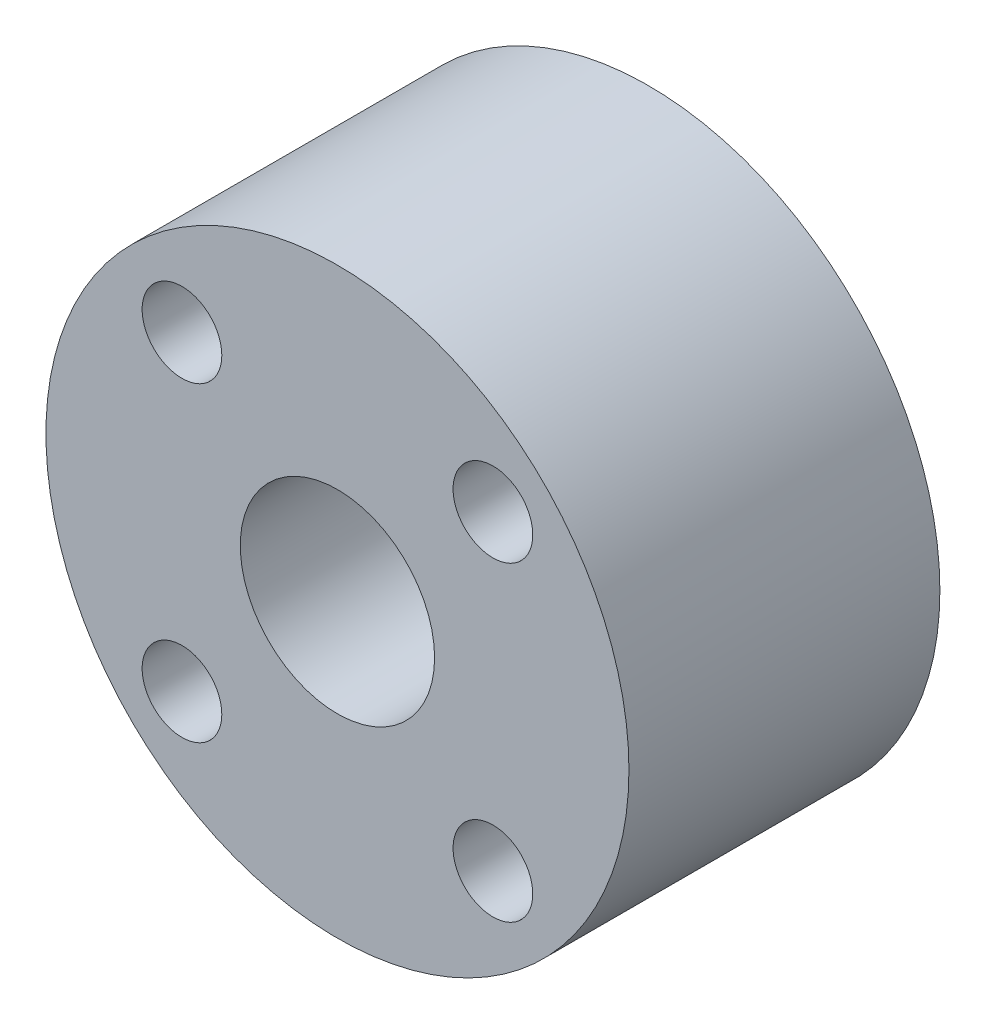
ISO-10303-21;
HEADER;
FILE_DESCRIPTION(('STEP AP214'),'2;1');
FILE_NAME('part.step','',(''),(''),'','','');
FILE_SCHEMA(('AUTOMOTIVE_DESIGN { 1 0 10303 214 1 1 1 1 }'));
ENDSEC;
DATA;
#1=APPLICATION_CONTEXT('core data for automotive mechanical design processes');
#2=APPLICATION_PROTOCOL_DEFINITION('international standard','automotive_design',2000,#1);
#3=PRODUCT_CONTEXT('',#1,'mechanical');
#4=PRODUCT('Part','Part','',(#3));
#5=PRODUCT_RELATED_PRODUCT_CATEGORY('part','',(#4));
#6=PRODUCT_DEFINITION_FORMATION('','',#4);
#7=PRODUCT_DEFINITION_CONTEXT('part definition',#1,'design');
#8=PRODUCT_DEFINITION('design','',#6,#7);
#9=PRODUCT_DEFINITION_SHAPE('','',#8);
#10=(LENGTH_UNIT() NAMED_UNIT(*) SI_UNIT(.MILLI.,.METRE.));
#11=(NAMED_UNIT(*) PLANE_ANGLE_UNIT() SI_UNIT($,.RADIAN.));
#12=(NAMED_UNIT(*) SI_UNIT($,.STERADIAN.) SOLID_ANGLE_UNIT());
#13=UNCERTAINTY_MEASURE_WITH_UNIT(LENGTH_MEASURE(1.E-05),#10,'distance_accuracy_value','');
#14=(GEOMETRIC_REPRESENTATION_CONTEXT(3) GLOBAL_UNCERTAINTY_ASSIGNED_CONTEXT((#13)) GLOBAL_UNIT_ASSIGNED_CONTEXT((#10,
#11,#12)) REPRESENTATION_CONTEXT('',''));
#15=CARTESIAN_POINT('',(0.,0.,0.));
#16=DIRECTION('',(0.,0.,1.));
#17=DIRECTION('',(1.,0.,0.));
#18=AXIS2_PLACEMENT_3D('',#15,#16,#17);
#19=CARTESIAN_POINT('',(0.,0.,16.));
#20=DIRECTION('',(0.,0.,1.));
#21=DIRECTION('',(1.,0.,0.));
#22=AXIS2_PLACEMENT_3D('',#19,#20,#21);
#23=PLANE('',#22);
#24=CARTESIAN_POINT('',(-8.,-8.,16.));
#25=DIRECTION('',(0.,0.,1.));
#26=DIRECTION('',(1.,0.,0.));
#27=AXIS2_PLACEMENT_3D('',#24,#25,#26);
#28=CIRCLE('',#27,2.05);
#29=CARTESIAN_POINT('',(-5.95,-8.,16.));
#30=VERTEX_POINT('',#29);
#31=EDGE_CURVE('E63',#30,#30,#28,.T.);
#32=ORIENTED_EDGE('',*,*,#31,.F.);
#33=EDGE_LOOP('',(#32));
#34=FACE_BOUND('',#33,.T.);
#35=CARTESIAN_POINT('',(8.,8.,16.));
#36=DIRECTION('',(0.,0.,1.));
#37=DIRECTION('',(1.,0.,0.));
#38=AXIS2_PLACEMENT_3D('',#35,#36,#37);
#39=CIRCLE('',#38,2.05);
#40=CARTESIAN_POINT('',(10.05,8.,16.));
#41=VERTEX_POINT('',#40);
#42=EDGE_CURVE('E51',#41,#41,#39,.T.);
#43=ORIENTED_EDGE('',*,*,#42,.F.);
#44=EDGE_LOOP('',(#43));
#45=FACE_BOUND('',#44,.T.);
#46=CARTESIAN_POINT('',(0.,0.,16.));
#47=DIRECTION('',(0.,0.,1.));
#48=DIRECTION('',(1.,0.,0.));
#49=AXIS2_PLACEMENT_3D('',#46,#47,#48);
#50=CIRCLE('',#49,15.);
#51=CARTESIAN_POINT('',(15.,0.,16.));
#52=VERTEX_POINT('',#51);
#53=EDGE_CURVE('E10',#52,#52,#50,.T.);
#54=ORIENTED_EDGE('',*,*,#53,.T.);
#55=EDGE_LOOP('',(#54));
#56=FACE_BOUND('',#55,.T.);
#57=CARTESIAN_POINT('',(-8.,8.,16.));
#58=DIRECTION('',(0.,0.,1.));
#59=DIRECTION('',(1.,0.,0.));
#60=AXIS2_PLACEMENT_3D('',#57,#58,#59);
#61=CIRCLE('',#60,2.05);
#62=CARTESIAN_POINT('',(-5.95,8.,16.));
#63=VERTEX_POINT('',#62);
#64=EDGE_CURVE('E46',#63,#63,#61,.T.);
#65=ORIENTED_EDGE('',*,*,#64,.F.);
#66=EDGE_LOOP('',(#65));
#67=FACE_BOUND('',#66,.T.);
#68=CARTESIAN_POINT('',(8.,-8.,16.));
#69=DIRECTION('',(0.,0.,1.));
#70=DIRECTION('',(1.,0.,0.));
#71=AXIS2_PLACEMENT_3D('',#68,#69,#70);
#72=CIRCLE('',#71,2.05);
#73=CARTESIAN_POINT('',(10.05,-8.,16.));
#74=VERTEX_POINT('',#73);
#75=EDGE_CURVE('E57',#74,#74,#72,.T.);
#76=ORIENTED_EDGE('',*,*,#75,.F.);
#77=EDGE_LOOP('',(#76));
#78=FACE_BOUND('',#77,.T.);
#79=CARTESIAN_POINT('',(0.,0.,16.));
#80=DIRECTION('',(0.,0.,1.));
#81=DIRECTION('',(1.,0.,0.));
#82=AXIS2_PLACEMENT_3D('',#79,#80,#81);
#83=CIRCLE('',#82,5.);
#84=CARTESIAN_POINT('',(5.,0.,16.));
#85=VERTEX_POINT('',#84);
#86=EDGE_CURVE('E69',#85,#85,#83,.T.);
#87=ORIENTED_EDGE('',*,*,#86,.F.);
#88=EDGE_LOOP('',(#87));
#89=FACE_BOUND('',#88,.T.);
#90=ADVANCED_FACE('F35',(#34,#45,#56,#67,#78,#89),#23,.T.);
#91=CARTESIAN_POINT('',(0.,0.,0.));
#92=DIRECTION('',(0.,0.,1.));
#93=DIRECTION('',(1.,0.,0.));
#94=AXIS2_PLACEMENT_3D('',#91,#92,#93);
#95=PLANE('',#94);
#96=CARTESIAN_POINT('',(0.,0.,0.));
#97=DIRECTION('',(0.,0.,1.));
#98=DIRECTION('',(1.,0.,0.));
#99=AXIS2_PLACEMENT_3D('',#96,#97,#98);
#100=CIRCLE('',#99,15.);
#101=CARTESIAN_POINT('',(15.,0.,0.));
#102=VERTEX_POINT('',#101);
#103=EDGE_CURVE('E39',#102,#102,#100,.T.);
#104=ORIENTED_EDGE('',*,*,#103,.F.);
#105=EDGE_LOOP('',(#104));
#106=FACE_BOUND('',#105,.T.);
#107=CARTESIAN_POINT('',(-8.,8.,0.));
#108=DIRECTION('',(0.,0.,1.));
#109=DIRECTION('',(1.,0.,0.));
#110=AXIS2_PLACEMENT_3D('',#107,#108,#109);
#111=CIRCLE('',#110,2.05);
#112=CARTESIAN_POINT('',(-5.95,8.,0.));
#113=VERTEX_POINT('',#112);
#114=EDGE_CURVE('E48',#113,#113,#111,.T.);
#115=ORIENTED_EDGE('',*,*,#114,.T.);
#116=EDGE_LOOP('',(#115));
#117=FACE_BOUND('',#116,.T.);
#118=CARTESIAN_POINT('',(8.,8.,0.));
#119=DIRECTION('',(0.,0.,1.));
#120=DIRECTION('',(1.,0.,0.));
#121=AXIS2_PLACEMENT_3D('',#118,#119,#120);
#122=CIRCLE('',#121,2.05);
#123=CARTESIAN_POINT('',(10.05,8.,0.));
#124=VERTEX_POINT('',#123);
#125=EDGE_CURVE('E54',#124,#124,#122,.T.);
#126=ORIENTED_EDGE('',*,*,#125,.T.);
#127=EDGE_LOOP('',(#126));
#128=FACE_BOUND('',#127,.T.);
#129=CARTESIAN_POINT('',(8.,-8.,0.));
#130=DIRECTION('',(0.,0.,1.));
#131=DIRECTION('',(1.,0.,0.));
#132=AXIS2_PLACEMENT_3D('',#129,#130,#131);
#133=CIRCLE('',#132,2.05);
#134=CARTESIAN_POINT('',(10.05,-8.,0.));
#135=VERTEX_POINT('',#134);
#136=EDGE_CURVE('E60',#135,#135,#133,.T.);
#137=ORIENTED_EDGE('',*,*,#136,.T.);
#138=EDGE_LOOP('',(#137));
#139=FACE_BOUND('',#138,.T.);
#140=CARTESIAN_POINT('',(-8.,-8.,0.));
#141=DIRECTION('',(0.,0.,1.));
#142=DIRECTION('',(1.,0.,0.));
#143=AXIS2_PLACEMENT_3D('',#140,#141,#142);
#144=CIRCLE('',#143,2.05);
#145=CARTESIAN_POINT('',(-5.95,-8.,0.));
#146=VERTEX_POINT('',#145);
#147=EDGE_CURVE('E66',#146,#146,#144,.T.);
#148=ORIENTED_EDGE('',*,*,#147,.T.);
#149=EDGE_LOOP('',(#148));
#150=FACE_BOUND('',#149,.T.);
#151=CARTESIAN_POINT('',(0.,0.,0.));
#152=DIRECTION('',(0.,0.,1.));
#153=DIRECTION('',(1.,0.,0.));
#154=AXIS2_PLACEMENT_3D('',#151,#152,#153);
#155=CIRCLE('',#154,5.);
#156=CARTESIAN_POINT('',(5.,0.,0.));
#157=VERTEX_POINT('',#156);
#158=EDGE_CURVE('E72',#157,#157,#155,.T.);
#159=ORIENTED_EDGE('',*,*,#158,.T.);
#160=EDGE_LOOP('',(#159));
#161=FACE_BOUND('',#160,.T.);
#162=ADVANCED_FACE('F82',(#106,#117,#128,#139,#150,#161),#95,.F.);
#163=CARTESIAN_POINT('',(0.,0.,16.));
#164=DIRECTION('',(0.,0.,-1.));
#165=DIRECTION('',(-1.,0.,0.));
#166=AXIS2_PLACEMENT_3D('',#163,#164,#165);
#167=CYLINDRICAL_SURFACE('',#166,15.);
#168=ORIENTED_EDGE('',*,*,#53,.F.);
#169=EDGE_LOOP('',(#168));
#170=FACE_BOUND('',#169,.T.);
#171=ORIENTED_EDGE('',*,*,#103,.T.);
#172=EDGE_LOOP('',(#171));
#173=FACE_BOUND('',#172,.T.);
#174=ADVANCED_FACE('F37',(#170,#173),#167,.T.);
#175=CARTESIAN_POINT('',(-8.,8.,16.));
#176=DIRECTION('',(0.,0.,-1.));
#177=DIRECTION('',(-1.,0.,0.));
#178=AXIS2_PLACEMENT_3D('',#175,#176,#177);
#179=CYLINDRICAL_SURFACE('',#178,2.05);
#180=ORIENTED_EDGE('',*,*,#64,.T.);
#181=EDGE_LOOP('',(#180));
#182=FACE_BOUND('',#181,.T.);
#183=ORIENTED_EDGE('',*,*,#114,.F.);
#184=EDGE_LOOP('',(#183));
#185=FACE_BOUND('',#184,.T.);
#186=ADVANCED_FACE('F92',(#182,#185),#179,.F.);
#187=CARTESIAN_POINT('',(8.,8.,16.));
#188=DIRECTION('',(0.,0.,-1.));
#189=DIRECTION('',(-1.,0.,0.));
#190=AXIS2_PLACEMENT_3D('',#187,#188,#189);
#191=CYLINDRICAL_SURFACE('',#190,2.05);
#192=ORIENTED_EDGE('',*,*,#42,.T.);
#193=EDGE_LOOP('',(#192));
#194=FACE_BOUND('',#193,.T.);
#195=ORIENTED_EDGE('',*,*,#125,.F.);
#196=EDGE_LOOP('',(#195));
#197=FACE_BOUND('',#196,.T.);
#198=ADVANCED_FACE('F95',(#194,#197),#191,.F.);
#199=CARTESIAN_POINT('',(8.,-8.,16.));
#200=DIRECTION('',(0.,0.,-1.));
#201=DIRECTION('',(-1.,0.,0.));
#202=AXIS2_PLACEMENT_3D('',#199,#200,#201);
#203=CYLINDRICAL_SURFACE('',#202,2.05);
#204=ORIENTED_EDGE('',*,*,#75,.T.);
#205=EDGE_LOOP('',(#204));
#206=FACE_BOUND('',#205,.T.);
#207=ORIENTED_EDGE('',*,*,#136,.F.);
#208=EDGE_LOOP('',(#207));
#209=FACE_BOUND('',#208,.T.);
#210=ADVANCED_FACE('F99',(#206,#209),#203,.F.);
#211=CARTESIAN_POINT('',(-8.,-8.,16.));
#212=DIRECTION('',(0.,0.,-1.));
#213=DIRECTION('',(-1.,0.,0.));
#214=AXIS2_PLACEMENT_3D('',#211,#212,#213);
#215=CYLINDRICAL_SURFACE('',#214,2.05);
#216=ORIENTED_EDGE('',*,*,#31,.T.);
#217=EDGE_LOOP('',(#216));
#218=FACE_BOUND('',#217,.T.);
#219=ORIENTED_EDGE('',*,*,#147,.F.);
#220=EDGE_LOOP('',(#219));
#221=FACE_BOUND('',#220,.T.);
#222=ADVANCED_FACE('F103',(#218,#221),#215,.F.);
#223=CARTESIAN_POINT('',(0.,0.,16.));
#224=DIRECTION('',(0.,0.,-1.));
#225=DIRECTION('',(-1.,0.,0.));
#226=AXIS2_PLACEMENT_3D('',#223,#224,#225);
#227=CYLINDRICAL_SURFACE('',#226,5.);
#228=ORIENTED_EDGE('',*,*,#86,.T.);
#229=EDGE_LOOP('',(#228));
#230=FACE_BOUND('',#229,.T.);
#231=ORIENTED_EDGE('',*,*,#158,.F.);
#232=EDGE_LOOP('',(#231));
#233=FACE_BOUND('',#232,.T.);
#234=ADVANCED_FACE('F78',(#230,#233),#227,.F.);
#235=CLOSED_SHELL('',(#90,#162,#174,#186,#198,#210,#222,#234));
#236=MANIFOLD_SOLID_BREP('B2',#235);
#237=ADVANCED_BREP_SHAPE_REPRESENTATION('',(#18,#236),#14);
#238=SHAPE_DEFINITION_REPRESENTATION(#9,#237);
ENDSEC;
END-ISO-10303-21;
